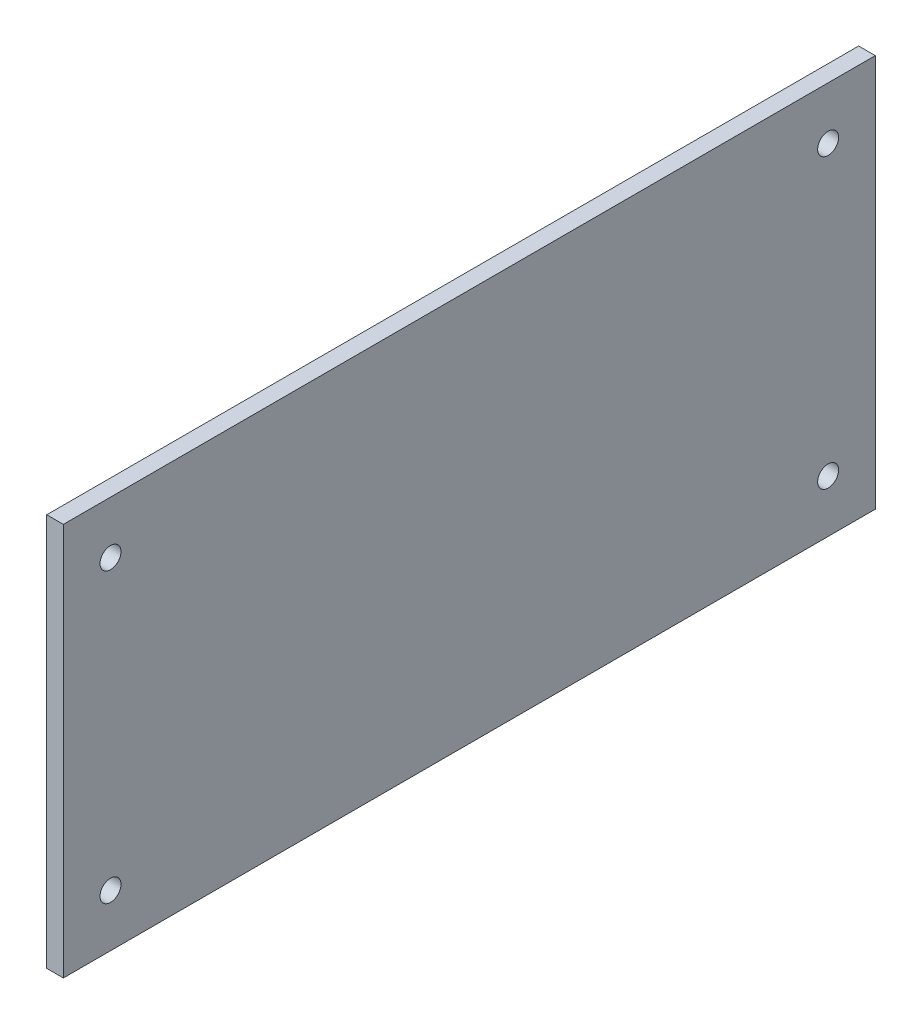
ISO-10303-21;
HEADER;
FILE_DESCRIPTION(('STEP AP214'),'2;1');
FILE_NAME('part.step','',(''),(''),'','','');
FILE_SCHEMA(('AUTOMOTIVE_DESIGN { 1 0 10303 214 1 1 1 1 }'));
ENDSEC;
DATA;
#1=APPLICATION_CONTEXT('core data for automotive mechanical design processes');
#2=APPLICATION_PROTOCOL_DEFINITION('international standard','automotive_design',2000,#1);
#3=PRODUCT_CONTEXT('',#1,'mechanical');
#4=PRODUCT('Part','Part','',(#3));
#5=PRODUCT_RELATED_PRODUCT_CATEGORY('part','',(#4));
#6=PRODUCT_DEFINITION_FORMATION('','',#4);
#7=PRODUCT_DEFINITION_CONTEXT('part definition',#1,'design');
#8=PRODUCT_DEFINITION('design','',#6,#7);
#9=PRODUCT_DEFINITION_SHAPE('','',#8);
#10=(LENGTH_UNIT() NAMED_UNIT(*) SI_UNIT(.MILLI.,.METRE.));
#11=(NAMED_UNIT(*) PLANE_ANGLE_UNIT() SI_UNIT($,.RADIAN.));
#12=(NAMED_UNIT(*) SI_UNIT($,.STERADIAN.) SOLID_ANGLE_UNIT());
#13=UNCERTAINTY_MEASURE_WITH_UNIT(LENGTH_MEASURE(1.E-05),#10,'distance_accuracy_value','');
#14=(GEOMETRIC_REPRESENTATION_CONTEXT(3) GLOBAL_UNCERTAINTY_ASSIGNED_CONTEXT((#13)) GLOBAL_UNIT_ASSIGNED_CONTEXT((#10,
#11,#12)) REPRESENTATION_CONTEXT('',''));
#15=CARTESIAN_POINT('',(0.,0.,0.));
#16=DIRECTION('',(0.,0.,1.));
#17=DIRECTION('',(1.,0.,0.));
#18=AXIS2_PLACEMENT_3D('',#15,#16,#17);
#19=CARTESIAN_POINT('',(3.175,0.,0.));
#20=DIRECTION('',(-1.,0.,0.));
#21=DIRECTION('',(0.,0.,1.));
#22=AXIS2_PLACEMENT_3D('',#19,#20,#21);
#23=PLANE('',#22);
#24=DIRECTION('',(0.,-1.,0.));
#25=VECTOR('',#24,1.);
#26=CARTESIAN_POINT('',(3.175,0.,0.));
#27=LINE('',#26,#25);
#28=CARTESIAN_POINT('',(3.175,75.,0.));
#29=VERTEX_POINT('',#28);
#30=CARTESIAN_POINT('',(3.175,0.,0.));
#31=VERTEX_POINT('',#30);
#32=EDGE_CURVE('E96',#29,#31,#27,.T.);
#33=ORIENTED_EDGE('',*,*,#32,.T.);
#34=DIRECTION('',(0.,0.,-1.));
#35=VECTOR('',#34,1.);
#36=CARTESIAN_POINT('',(3.175,0.,0.));
#37=LINE('',#36,#35);
#38=CARTESIAN_POINT('',(3.175,0.,-155.));
#39=VERTEX_POINT('',#38);
#40=EDGE_CURVE('E91',#31,#39,#37,.T.);
#41=ORIENTED_EDGE('',*,*,#40,.T.);
#42=DIRECTION('',(0.,1.,0.));
#43=VECTOR('',#42,1.);
#44=CARTESIAN_POINT('',(3.175,0.,-155.));
#45=LINE('',#44,#43);
#46=CARTESIAN_POINT('',(3.175,75.,-155.));
#47=VERTEX_POINT('',#46);
#48=EDGE_CURVE('E94',#39,#47,#45,.T.);
#49=ORIENTED_EDGE('',*,*,#48,.T.);
#50=DIRECTION('',(0.,0.,1.));
#51=VECTOR('',#50,1.);
#52=CARTESIAN_POINT('',(3.175,75.,0.));
#53=LINE('',#52,#51);
#54=EDGE_CURVE('E61',#47,#29,#53,.T.);
#55=ORIENTED_EDGE('',*,*,#54,.T.);
#56=EDGE_LOOP('',(#33,#41,#49,#55));
#57=FACE_BOUND('',#56,.T.);
#58=CARTESIAN_POINT('',(3.175,10.,-9.00000000000001));
#59=DIRECTION('',(1.,0.,0.));
#60=DIRECTION('',(0.,0.,-1.));
#61=AXIS2_PLACEMENT_3D('',#58,#59,#60);
#62=CIRCLE('',#61,2.);
#63=CARTESIAN_POINT('',(3.175,10.,-11.));
#64=VERTEX_POINT('',#63);
#65=EDGE_CURVE('E116',#64,#64,#62,.T.);
#66=ORIENTED_EDGE('',*,*,#65,.F.);
#67=EDGE_LOOP('',(#66));
#68=FACE_BOUND('',#67,.T.);
#69=CARTESIAN_POINT('',(3.175,10.,-146.));
#70=DIRECTION('',(1.,0.,0.));
#71=DIRECTION('',(0.,0.,-1.));
#72=AXIS2_PLACEMENT_3D('',#69,#70,#71);
#73=CIRCLE('',#72,2.);
#74=CARTESIAN_POINT('',(3.175,10.,-148.));
#75=VERTEX_POINT('',#74);
#76=EDGE_CURVE('E138',#75,#75,#73,.T.);
#77=ORIENTED_EDGE('',*,*,#76,.F.);
#78=EDGE_LOOP('',(#77));
#79=FACE_BOUND('',#78,.T.);
#80=CARTESIAN_POINT('',(3.175,65.,-146.));
#81=DIRECTION('',(1.,0.,0.));
#82=DIRECTION('',(0.,0.,-1.));
#83=AXIS2_PLACEMENT_3D('',#80,#81,#82);
#84=CIRCLE('',#83,2.);
#85=CARTESIAN_POINT('',(3.175,65.,-148.));
#86=VERTEX_POINT('',#85);
#87=EDGE_CURVE('E146',#86,#86,#84,.T.);
#88=ORIENTED_EDGE('',*,*,#87,.F.);
#89=EDGE_LOOP('',(#88));
#90=FACE_BOUND('',#89,.T.);
#91=CARTESIAN_POINT('',(3.175,65.,-9.00000000000001));
#92=DIRECTION('',(1.,0.,0.));
#93=DIRECTION('',(0.,0.,-1.));
#94=AXIS2_PLACEMENT_3D('',#91,#92,#93);
#95=CIRCLE('',#94,2.);
#96=CARTESIAN_POINT('',(3.175,65.,-11.));
#97=VERTEX_POINT('',#96);
#98=EDGE_CURVE('E154',#97,#97,#95,.T.);
#99=ORIENTED_EDGE('',*,*,#98,.F.);
#100=EDGE_LOOP('',(#99));
#101=FACE_BOUND('',#100,.T.);
#102=ADVANCED_FACE('F43',(#57,#68,#79,#90,#101),#23,.F.);
#103=CARTESIAN_POINT('',(0.,0.,0.));
#104=DIRECTION('',(-1.,0.,0.));
#105=DIRECTION('',(0.,0.,1.));
#106=AXIS2_PLACEMENT_3D('',#103,#104,#105);
#107=PLANE('',#106);
#108=CARTESIAN_POINT('',(0.,65.,-146.));
#109=DIRECTION('',(1.,0.,0.));
#110=DIRECTION('',(0.,0.,-1.));
#111=AXIS2_PLACEMENT_3D('',#108,#109,#110);
#112=CIRCLE('',#111,2.);
#113=CARTESIAN_POINT('',(0.,65.,-148.));
#114=VERTEX_POINT('',#113);
#115=EDGE_CURVE('E150',#114,#114,#112,.T.);
#116=ORIENTED_EDGE('',*,*,#115,.T.);
#117=EDGE_LOOP('',(#116));
#118=FACE_BOUND('',#117,.T.);
#119=CARTESIAN_POINT('',(0.,10.,-9.00000000000001));
#120=DIRECTION('',(1.,0.,0.));
#121=DIRECTION('',(0.,0.,-1.));
#122=AXIS2_PLACEMENT_3D('',#119,#120,#121);
#123=CIRCLE('',#122,2.);
#124=CARTESIAN_POINT('',(0.,10.,-11.));
#125=VERTEX_POINT('',#124);
#126=EDGE_CURVE('E134',#125,#125,#123,.T.);
#127=ORIENTED_EDGE('',*,*,#126,.T.);
#128=EDGE_LOOP('',(#127));
#129=FACE_BOUND('',#128,.T.);
#130=DIRECTION('',(0.,-1.,0.));
#131=VECTOR('',#130,1.);
#132=CARTESIAN_POINT('',(0.,0.,0.));
#133=LINE('',#132,#131);
#134=CARTESIAN_POINT('',(0.,75.,0.));
#135=VERTEX_POINT('',#134);
#136=CARTESIAN_POINT('',(0.,0.,0.));
#137=VERTEX_POINT('',#136);
#138=EDGE_CURVE('E112',#135,#137,#133,.T.);
#139=ORIENTED_EDGE('',*,*,#138,.F.);
#140=DIRECTION('',(0.,0.,1.));
#141=VECTOR('',#140,1.);
#142=CARTESIAN_POINT('',(0.,75.,0.));
#143=LINE('',#142,#141);
#144=CARTESIAN_POINT('',(0.,75.,-155.));
#145=VERTEX_POINT('',#144);
#146=EDGE_CURVE('E84',#145,#135,#143,.T.);
#147=ORIENTED_EDGE('',*,*,#146,.F.);
#148=DIRECTION('',(0.,1.,0.));
#149=VECTOR('',#148,1.);
#150=CARTESIAN_POINT('',(0.,0.,-155.));
#151=LINE('',#150,#149);
#152=CARTESIAN_POINT('',(0.,0.,-155.));
#153=VERTEX_POINT('',#152);
#154=EDGE_CURVE('E78',#153,#145,#151,.T.);
#155=ORIENTED_EDGE('',*,*,#154,.F.);
#156=DIRECTION('',(0.,0.,-1.));
#157=VECTOR('',#156,1.);
#158=CARTESIAN_POINT('',(0.,0.,0.));
#159=LINE('',#158,#157);
#160=EDGE_CURVE('E101',#137,#153,#159,.T.);
#161=ORIENTED_EDGE('',*,*,#160,.F.);
#162=EDGE_LOOP('',(#139,#147,#155,#161));
#163=FACE_BOUND('',#162,.T.);
#164=CARTESIAN_POINT('',(0.,10.,-146.));
#165=DIRECTION('',(1.,0.,0.));
#166=DIRECTION('',(0.,0.,-1.));
#167=AXIS2_PLACEMENT_3D('',#164,#165,#166);
#168=CIRCLE('',#167,2.);
#169=CARTESIAN_POINT('',(0.,10.,-148.));
#170=VERTEX_POINT('',#169);
#171=EDGE_CURVE('E142',#170,#170,#168,.T.);
#172=ORIENTED_EDGE('',*,*,#171,.T.);
#173=EDGE_LOOP('',(#172));
#174=FACE_BOUND('',#173,.T.);
#175=CARTESIAN_POINT('',(0.,65.,-9.00000000000001));
#176=DIRECTION('',(1.,0.,0.));
#177=DIRECTION('',(0.,0.,-1.));
#178=AXIS2_PLACEMENT_3D('',#175,#176,#177);
#179=CIRCLE('',#178,2.);
#180=CARTESIAN_POINT('',(0.,65.,-11.));
#181=VERTEX_POINT('',#180);
#182=EDGE_CURVE('E158',#181,#181,#179,.T.);
#183=ORIENTED_EDGE('',*,*,#182,.T.);
#184=EDGE_LOOP('',(#183));
#185=FACE_BOUND('',#184,.T.);
#186=ADVANCED_FACE('F129',(#118,#129,#163,#174,#185),#107,.T.);
#187=CARTESIAN_POINT('',(3.175,0.,0.));
#188=DIRECTION('',(0.,0.,-1.));
#189=DIRECTION('',(-1.,0.,0.));
#190=AXIS2_PLACEMENT_3D('',#187,#188,#189);
#191=PLANE('',#190);
#192=ORIENTED_EDGE('',*,*,#138,.T.);
#193=DIRECTION('',(-1.,0.,0.));
#194=VECTOR('',#193,1.);
#195=CARTESIAN_POINT('',(3.175,0.,0.));
#196=LINE('',#195,#194);
#197=EDGE_CURVE('E11',#31,#137,#196,.T.);
#198=ORIENTED_EDGE('',*,*,#197,.F.);
#199=ORIENTED_EDGE('',*,*,#32,.F.);
#200=DIRECTION('',(-1.,0.,0.));
#201=VECTOR('',#200,1.);
#202=CARTESIAN_POINT('',(3.175,75.,0.));
#203=LINE('',#202,#201);
#204=EDGE_CURVE('E108',#29,#135,#203,.T.);
#205=ORIENTED_EDGE('',*,*,#204,.T.);
#206=EDGE_LOOP('',(#192,#198,#199,#205));
#207=FACE_BOUND('',#206,.T.);
#208=ADVANCED_FACE('F45',(#207),#191,.F.);
#209=CARTESIAN_POINT('',(3.175,0.,0.));
#210=DIRECTION('',(0.,1.,0.));
#211=DIRECTION('',(0.,0.,1.));
#212=AXIS2_PLACEMENT_3D('',#209,#210,#211);
#213=PLANE('',#212);
#214=ORIENTED_EDGE('',*,*,#160,.T.);
#215=DIRECTION('',(-1.,0.,0.));
#216=VECTOR('',#215,1.);
#217=CARTESIAN_POINT('',(3.175,0.,-155.));
#218=LINE('',#217,#216);
#219=EDGE_CURVE('E53',#39,#153,#218,.T.);
#220=ORIENTED_EDGE('',*,*,#219,.F.);
#221=ORIENTED_EDGE('',*,*,#40,.F.);
#222=ORIENTED_EDGE('',*,*,#197,.T.);
#223=EDGE_LOOP('',(#214,#220,#221,#222));
#224=FACE_BOUND('',#223,.T.);
#225=ADVANCED_FACE('F100',(#224),#213,.F.);
#226=CARTESIAN_POINT('',(3.175,0.,-155.));
#227=DIRECTION('',(0.,0.,1.));
#228=DIRECTION('',(1.,0.,0.));
#229=AXIS2_PLACEMENT_3D('',#226,#227,#228);
#230=PLANE('',#229);
#231=ORIENTED_EDGE('',*,*,#154,.T.);
#232=DIRECTION('',(-1.,0.,0.));
#233=VECTOR('',#232,1.);
#234=CARTESIAN_POINT('',(3.175,75.,-155.));
#235=LINE('',#234,#233);
#236=EDGE_CURVE('E103',#47,#145,#235,.T.);
#237=ORIENTED_EDGE('',*,*,#236,.F.);
#238=ORIENTED_EDGE('',*,*,#48,.F.);
#239=ORIENTED_EDGE('',*,*,#219,.T.);
#240=EDGE_LOOP('',(#231,#237,#238,#239));
#241=FACE_BOUND('',#240,.T.);
#242=ADVANCED_FACE('F104',(#241),#230,.F.);
#243=CARTESIAN_POINT('',(3.175,75.,0.));
#244=DIRECTION('',(0.,-1.,0.));
#245=DIRECTION('',(0.,0.,-1.));
#246=AXIS2_PLACEMENT_3D('',#243,#244,#245);
#247=PLANE('',#246);
#248=ORIENTED_EDGE('',*,*,#146,.T.);
#249=ORIENTED_EDGE('',*,*,#204,.F.);
#250=ORIENTED_EDGE('',*,*,#54,.F.);
#251=ORIENTED_EDGE('',*,*,#236,.T.);
#252=EDGE_LOOP('',(#248,#249,#250,#251));
#253=FACE_BOUND('',#252,.T.);
#254=ADVANCED_FACE('F126',(#253),#247,.F.);
#255=CARTESIAN_POINT('',(3.175,10.,-9.00000000000001));
#256=DIRECTION('',(-1.,0.,0.));
#257=DIRECTION('',(0.,0.,1.));
#258=AXIS2_PLACEMENT_3D('',#255,#256,#257);
#259=CYLINDRICAL_SURFACE('',#258,2.);
#260=ORIENTED_EDGE('',*,*,#65,.T.);
#261=EDGE_LOOP('',(#260));
#262=FACE_BOUND('',#261,.T.);
#263=ORIENTED_EDGE('',*,*,#126,.F.);
#264=EDGE_LOOP('',(#263));
#265=FACE_BOUND('',#264,.T.);
#266=ADVANCED_FACE('F177',(#262,#265),#259,.F.);
#267=CARTESIAN_POINT('',(3.175,10.,-146.));
#268=DIRECTION('',(-1.,0.,0.));
#269=DIRECTION('',(0.,0.,1.));
#270=AXIS2_PLACEMENT_3D('',#267,#268,#269);
#271=CYLINDRICAL_SURFACE('',#270,2.);
#272=ORIENTED_EDGE('',*,*,#76,.T.);
#273=EDGE_LOOP('',(#272));
#274=FACE_BOUND('',#273,.T.);
#275=ORIENTED_EDGE('',*,*,#171,.F.);
#276=EDGE_LOOP('',(#275));
#277=FACE_BOUND('',#276,.T.);
#278=ADVANCED_FACE('F231',(#274,#277),#271,.F.);
#279=CARTESIAN_POINT('',(3.175,65.,-146.));
#280=DIRECTION('',(-1.,0.,0.));
#281=DIRECTION('',(0.,0.,1.));
#282=AXIS2_PLACEMENT_3D('',#279,#280,#281);
#283=CYLINDRICAL_SURFACE('',#282,2.);
#284=ORIENTED_EDGE('',*,*,#87,.T.);
#285=EDGE_LOOP('',(#284));
#286=FACE_BOUND('',#285,.T.);
#287=ORIENTED_EDGE('',*,*,#115,.F.);
#288=EDGE_LOOP('',(#287));
#289=FACE_BOUND('',#288,.T.);
#290=ADVANCED_FACE('F240',(#286,#289),#283,.F.);
#291=CARTESIAN_POINT('',(3.175,65.,-9.00000000000001));
#292=DIRECTION('',(-1.,0.,0.));
#293=DIRECTION('',(0.,0.,1.));
#294=AXIS2_PLACEMENT_3D('',#291,#292,#293);
#295=CYLINDRICAL_SURFACE('',#294,2.);
#296=ORIENTED_EDGE('',*,*,#98,.T.);
#297=EDGE_LOOP('',(#296));
#298=FACE_BOUND('',#297,.T.);
#299=ORIENTED_EDGE('',*,*,#182,.F.);
#300=EDGE_LOOP('',(#299));
#301=FACE_BOUND('',#300,.T.);
#302=ADVANCED_FACE('F166',(#298,#301),#295,.F.);
#303=CLOSED_SHELL('',(#102,#186,#208,#225,#242,#254,#266,#278,#290,#302));
#304=MANIFOLD_SOLID_BREP('B2',#303);
#305=ADVANCED_BREP_SHAPE_REPRESENTATION('',(#18,#304),#14);
#306=SHAPE_DEFINITION_REPRESENTATION(#9,#305);
ENDSEC;
END-ISO-10303-21;
